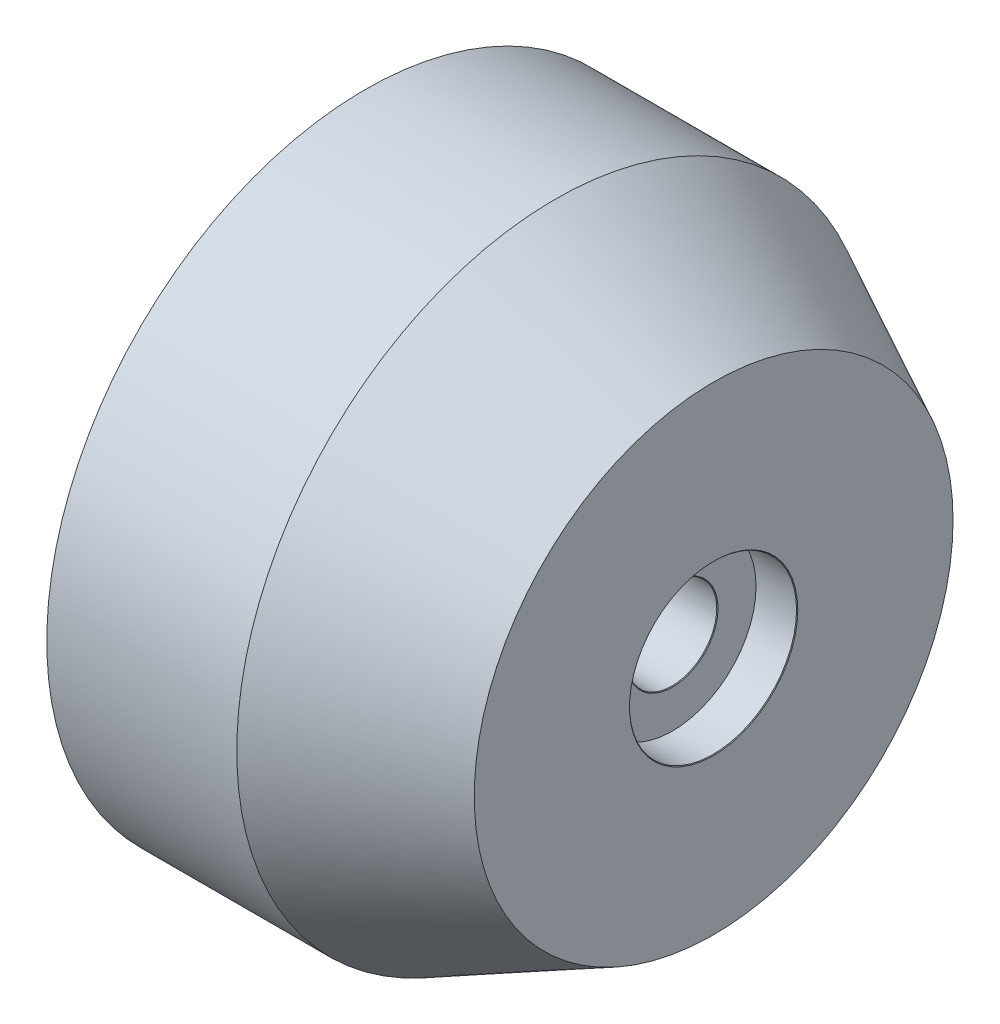
ISO-10303-21;
HEADER;
FILE_DESCRIPTION(('STEP AP214'),'2;1');
FILE_NAME('part.step','',(''),(''),'','','');
FILE_SCHEMA(('AUTOMOTIVE_DESIGN { 1 0 10303 214 1 1 1 1 }'));
ENDSEC;
DATA;
#1=APPLICATION_CONTEXT('core data for automotive mechanical design processes');
#2=APPLICATION_PROTOCOL_DEFINITION('international standard','automotive_design',2000,#1);
#3=PRODUCT_CONTEXT('',#1,'mechanical');
#4=PRODUCT('Part','Part','',(#3));
#5=PRODUCT_RELATED_PRODUCT_CATEGORY('part','',(#4));
#6=PRODUCT_DEFINITION_FORMATION('','',#4);
#7=PRODUCT_DEFINITION_CONTEXT('part definition',#1,'design');
#8=PRODUCT_DEFINITION('design','',#6,#7);
#9=PRODUCT_DEFINITION_SHAPE('','',#8);
#10=(LENGTH_UNIT() NAMED_UNIT(*) SI_UNIT(.MILLI.,.METRE.));
#11=(NAMED_UNIT(*) PLANE_ANGLE_UNIT() SI_UNIT($,.RADIAN.));
#12=(NAMED_UNIT(*) SI_UNIT($,.STERADIAN.) SOLID_ANGLE_UNIT());
#13=UNCERTAINTY_MEASURE_WITH_UNIT(LENGTH_MEASURE(1.E-05),#10,'distance_accuracy_value','');
#14=(GEOMETRIC_REPRESENTATION_CONTEXT(3) GLOBAL_UNCERTAINTY_ASSIGNED_CONTEXT((#13)) GLOBAL_UNIT_ASSIGNED_CONTEXT((#10,
#11,#12)) REPRESENTATION_CONTEXT('',''));
#15=CARTESIAN_POINT('',(0.,0.,0.));
#16=DIRECTION('',(0.,0.,1.));
#17=DIRECTION('',(1.,0.,0.));
#18=AXIS2_PLACEMENT_3D('',#15,#16,#17);
#19=CARTESIAN_POINT('',(-5.82137303331799,0.,0.));
#20=DIRECTION('',(-1.,0.,0.));
#21=DIRECTION('',(0.,0.,1.));
#22=AXIS2_PLACEMENT_3D('',#19,#20,#21);
#23=PLANE('',#22);
#24=CARTESIAN_POINT('',(-5.82137303331799,0.,0.));
#25=DIRECTION('',(-1.,0.,0.));
#26=DIRECTION('',(0.,0.,1.));
#27=AXIS2_PLACEMENT_3D('',#24,#25,#26);
#28=CIRCLE('',#27,1.8);
#29=CARTESIAN_POINT('',(-5.82137303331799,0.,1.8));
#30=VERTEX_POINT('',#29);
#31=EDGE_CURVE('E43',#30,#30,#28,.F.);
#32=ORIENTED_EDGE('',*,*,#31,.T.);
#33=EDGE_LOOP('',(#32));
#34=FACE_BOUND('',#33,.T.);
#35=CARTESIAN_POINT('',(-5.82137303331799,0.,0.));
#36=DIRECTION('',(-1.,0.,0.));
#37=DIRECTION('',(0.,0.,1.));
#38=AXIS2_PLACEMENT_3D('',#35,#36,#37);
#39=CIRCLE('',#38,5.08);
#40=CARTESIAN_POINT('',(-5.82137303331799,0.,5.08));
#41=VERTEX_POINT('',#40);
#42=EDGE_CURVE('E88',#41,#41,#39,.T.);
#43=ORIENTED_EDGE('',*,*,#42,.T.);
#44=EDGE_LOOP('',(#43));
#45=FACE_BOUND('',#44,.T.);
#46=ADVANCED_FACE('F39',(#34,#45),#23,.T.);
#47=CARTESIAN_POINT('',(-5.82137303331799,0.,0.));
#48=DIRECTION('',(-1.,0.,0.));
#49=DIRECTION('',(0.,0.,1.));
#50=AXIS2_PLACEMENT_3D('',#47,#48,#49);
#51=CIRCLE('',#50,6.35);
#52=CARTESIAN_POINT('',(-5.82137303331799,0.,6.35));
#53=VERTEX_POINT('',#52);
#54=EDGE_CURVE('E79',#53,#53,#51,.T.);
#55=ORIENTED_EDGE('',*,*,#54,.F.);
#56=EDGE_LOOP('',(#55));
#57=FACE_BOUND('',#56,.T.);
#58=CARTESIAN_POINT('',(-5.82137303331799,0.,0.));
#59=DIRECTION('',(1.,0.,0.));
#60=DIRECTION('',(0.,0.,-1.));
#61=AXIS2_PLACEMENT_3D('',#58,#59,#60);
#62=CIRCLE('',#61,12.7762);
#63=CARTESIAN_POINT('',(-5.82137303331799,0.,-12.7762));
#64=VERTEX_POINT('',#63);
#65=EDGE_CURVE('E67',#64,#64,#62,.T.);
#66=ORIENTED_EDGE('',*,*,#65,.F.);
#67=EDGE_LOOP('',(#66));
#68=FACE_BOUND('',#67,.T.);
#69=ADVANCED_FACE('F109',(#57,#68),#23,.T.);
#70=CARTESIAN_POINT('',(8.14862696668201,0.,0.));
#71=DIRECTION('',(1.,0.,0.));
#72=DIRECTION('',(0.,0.,-1.));
#73=AXIS2_PLACEMENT_3D('',#70,#71,#72);
#74=CONICAL_SURFACE('',#73,3.375,0.785398163397483);
#75=CARTESIAN_POINT('',(8.12362696668201,0.,0.));
#76=DIRECTION('',(1.,0.,0.));
#77=DIRECTION('',(0.,0.,-1.));
#78=AXIS2_PLACEMENT_3D('',#75,#76,#77);
#79=CIRCLE('',#78,3.35);
#80=CARTESIAN_POINT('',(8.12362696668201,0.,-3.35));
#81=VERTEX_POINT('',#80);
#82=EDGE_CURVE('E48',#81,#81,#79,.T.);
#83=ORIENTED_EDGE('',*,*,#82,.F.);
#84=EDGE_LOOP('',(#83));
#85=FACE_BOUND('',#84,.T.);
#86=CARTESIAN_POINT('',(8.14862696668201,0.,0.));
#87=DIRECTION('',(1.,0.,0.));
#88=DIRECTION('',(0.,0.,-1.));
#89=AXIS2_PLACEMENT_3D('',#86,#87,#88);
#90=CIRCLE('',#89,3.375);
#91=CARTESIAN_POINT('',(8.14862696668201,0.,-3.375));
#92=VERTEX_POINT('',#91);
#93=EDGE_CURVE('E10',#92,#92,#90,.T.);
#94=ORIENTED_EDGE('',*,*,#93,.T.);
#95=EDGE_LOOP('',(#94));
#96=FACE_BOUND('',#95,.T.);
#97=ADVANCED_FACE('F114',(#85,#96),#74,.F.);
#98=CARTESIAN_POINT('',(8.14862696668201,0.,0.));
#99=DIRECTION('',(1.,0.,0.));
#100=DIRECTION('',(0.,0.,-1.));
#101=AXIS2_PLACEMENT_3D('',#98,#99,#100);
#102=PLANE('',#101);
#103=ORIENTED_EDGE('',*,*,#93,.F.);
#104=EDGE_LOOP('',(#103));
#105=FACE_BOUND('',#104,.T.);
#106=CARTESIAN_POINT('',(8.14862696668201,0.,0.));
#107=DIRECTION('',(1.,0.,0.));
#108=DIRECTION('',(0.,0.,-1.));
#109=AXIS2_PLACEMENT_3D('',#106,#107,#108);
#110=CIRCLE('',#109,9.6012);
#111=CARTESIAN_POINT('',(8.14862696668201,0.,-9.6012));
#112=VERTEX_POINT('',#111);
#113=EDGE_CURVE('E71',#112,#112,#110,.T.);
#114=ORIENTED_EDGE('',*,*,#113,.T.);
#115=EDGE_LOOP('',(#114));
#116=FACE_BOUND('',#115,.T.);
#117=ADVANCED_FACE('F130',(#105,#116),#102,.T.);
#118=CARTESIAN_POINT('',(8.14862696668201,0.,0.));
#119=DIRECTION('',(-1.,0.,0.));
#120=DIRECTION('',(0.,0.,1.));
#121=AXIS2_PLACEMENT_3D('',#118,#119,#120);
#122=CONICAL_SURFACE('',#121,9.6012,0.463647609000804);
#123=CARTESIAN_POINT('',(1.79862696668198,0.,0.));
#124=DIRECTION('',(1.,0.,0.));
#125=DIRECTION('',(0.,0.,-1.));
#126=AXIS2_PLACEMENT_3D('',#123,#124,#125);
#127=CIRCLE('',#126,12.7762);
#128=CARTESIAN_POINT('',(1.79862696668198,0.,-12.7762));
#129=VERTEX_POINT('',#128);
#130=EDGE_CURVE('E75',#129,#129,#127,.F.);
#131=ORIENTED_EDGE('',*,*,#130,.F.);
#132=EDGE_LOOP('',(#131));
#133=FACE_BOUND('',#132,.T.);
#134=ORIENTED_EDGE('',*,*,#113,.F.);
#135=EDGE_LOOP('',(#134));
#136=FACE_BOUND('',#135,.T.);
#137=ADVANCED_FACE('F120',(#133,#136),#122,.T.);
#138=CARTESIAN_POINT('',(24.17211464598,0.,0.));
#139=DIRECTION('',(1.,0.,0.));
#140=DIRECTION('',(0.,0.,-1.));
#141=AXIS2_PLACEMENT_3D('',#138,#139,#140);
#142=CYLINDRICAL_SURFACE('',#141,12.7762);
#143=ORIENTED_EDGE('',*,*,#130,.T.);
#144=EDGE_LOOP('',(#143));
#145=FACE_BOUND('',#144,.T.);
#146=ORIENTED_EDGE('',*,*,#65,.T.);
#147=EDGE_LOOP('',(#146));
#148=FACE_BOUND('',#147,.T.);
#149=ADVANCED_FACE('F117',(#145,#148),#142,.T.);
#150=CARTESIAN_POINT('',(8.14862696668201,0.,0.));
#151=DIRECTION('',(1.,0.,0.));
#152=DIRECTION('',(0.,0.,-1.));
#153=AXIS2_PLACEMENT_3D('',#150,#151,#152);
#154=CYLINDRICAL_SURFACE('',#153,3.35);
#155=CARTESIAN_POINT('',(6.49862696668201,0.,0.));
#156=DIRECTION('',(1.,0.,0.));
#157=DIRECTION('',(0.,0.,-1.));
#158=AXIS2_PLACEMENT_3D('',#155,#156,#157);
#159=CIRCLE('',#158,3.35);
#160=CARTESIAN_POINT('',(6.49862696668201,0.,-3.35));
#161=VERTEX_POINT('',#160);
#162=EDGE_CURVE('E53',#161,#161,#159,.T.);
#163=ORIENTED_EDGE('',*,*,#162,.F.);
#164=EDGE_LOOP('',(#163));
#165=FACE_BOUND('',#164,.T.);
#166=ORIENTED_EDGE('',*,*,#82,.T.);
#167=EDGE_LOOP('',(#166));
#168=FACE_BOUND('',#167,.T.);
#169=ADVANCED_FACE('F119',(#165,#168),#154,.F.);
#170=CARTESIAN_POINT('',(6.49862696668201,1.825,0.));
#171=DIRECTION('',(-1.,0.,0.));
#172=DIRECTION('',(0.,0.,1.));
#173=AXIS2_PLACEMENT_3D('',#170,#171,#172);
#174=PLANE('',#173);
#175=CARTESIAN_POINT('',(6.49862696668201,0.,0.));
#176=DIRECTION('',(1.,0.,0.));
#177=DIRECTION('',(0.,0.,-1.));
#178=AXIS2_PLACEMENT_3D('',#175,#176,#177);
#179=CIRCLE('',#178,1.825);
#180=CARTESIAN_POINT('',(6.49862696668201,0.,-1.825));
#181=VERTEX_POINT('',#180);
#182=EDGE_CURVE('E59',#181,#181,#179,.T.);
#183=ORIENTED_EDGE('',*,*,#182,.F.);
#184=EDGE_LOOP('',(#183));
#185=FACE_BOUND('',#184,.T.);
#186=ORIENTED_EDGE('',*,*,#162,.T.);
#187=EDGE_LOOP('',(#186));
#188=FACE_BOUND('',#187,.T.);
#189=ADVANCED_FACE('F127',(#185,#188),#174,.F.);
#190=CARTESIAN_POINT('',(6.49862696668201,0.,0.));
#191=DIRECTION('',(1.,0.,0.));
#192=DIRECTION('',(0.,0.,-1.));
#193=AXIS2_PLACEMENT_3D('',#190,#191,#192);
#194=CONICAL_SURFACE('',#193,1.825,0.785398163397275);
#195=CARTESIAN_POINT('',(6.47362696668201,0.,0.));
#196=DIRECTION('',(1.,0.,0.));
#197=DIRECTION('',(0.,0.,-1.));
#198=AXIS2_PLACEMENT_3D('',#195,#196,#197);
#199=CIRCLE('',#198,1.80000000000001);
#200=CARTESIAN_POINT('',(6.47362696668201,0.,-1.80000000000001));
#201=VERTEX_POINT('',#200);
#202=EDGE_CURVE('E63',#201,#201,#199,.T.);
#203=ORIENTED_EDGE('',*,*,#202,.F.);
#204=EDGE_LOOP('',(#203));
#205=FACE_BOUND('',#204,.T.);
#206=ORIENTED_EDGE('',*,*,#182,.T.);
#207=EDGE_LOOP('',(#206));
#208=FACE_BOUND('',#207,.T.);
#209=ADVANCED_FACE('F151',(#205,#208),#194,.F.);
#210=CARTESIAN_POINT('',(-15.6638730333181,0.,0.));
#211=DIRECTION('',(-1.,0.,0.));
#212=DIRECTION('',(0.,0.,1.));
#213=AXIS2_PLACEMENT_3D('',#210,#211,#212);
#214=CYLINDRICAL_SURFACE('',#213,1.8);
#215=ORIENTED_EDGE('',*,*,#202,.T.);
#216=EDGE_LOOP('',(#215));
#217=FACE_BOUND('',#216,.T.);
#218=ORIENTED_EDGE('',*,*,#31,.F.);
#219=EDGE_LOOP('',(#218));
#220=FACE_BOUND('',#219,.T.);
#221=ADVANCED_FACE('F41',(#217,#220),#214,.F.);
#222=CARTESIAN_POINT('',(-4.55137303331799,0.,0.));
#223=DIRECTION('',(-1.,0.,0.));
#224=DIRECTION('',(0.,0.,1.));
#225=AXIS2_PLACEMENT_3D('',#222,#223,#224);
#226=CYLINDRICAL_SURFACE('',#225,6.35);
#227=CARTESIAN_POINT('',(-4.55137303331799,0.,0.));
#228=DIRECTION('',(-1.,0.,0.));
#229=DIRECTION('',(0.,0.,1.));
#230=AXIS2_PLACEMENT_3D('',#227,#228,#229);
#231=CIRCLE('',#230,6.35);
#232=CARTESIAN_POINT('',(-4.55137303331799,0.,6.35));
#233=VERTEX_POINT('',#232);
#234=EDGE_CURVE('E83',#233,#233,#231,.T.);
#235=ORIENTED_EDGE('',*,*,#234,.F.);
#236=EDGE_LOOP('',(#235));
#237=FACE_BOUND('',#236,.T.);
#238=ORIENTED_EDGE('',*,*,#54,.T.);
#239=EDGE_LOOP('',(#238));
#240=FACE_BOUND('',#239,.T.);
#241=ADVANCED_FACE('F102',(#237,#240),#226,.F.);
#242=CARTESIAN_POINT('',(-4.55137303331799,0.,0.));
#243=DIRECTION('',(-1.,0.,0.));
#244=DIRECTION('',(0.,0.,1.));
#245=AXIS2_PLACEMENT_3D('',#242,#243,#244);
#246=PLANE('',#245);
#247=CARTESIAN_POINT('',(-4.55137303331799,0.,0.));
#248=DIRECTION('',(-1.,0.,0.));
#249=DIRECTION('',(0.,0.,1.));
#250=AXIS2_PLACEMENT_3D('',#247,#248,#249);
#251=CIRCLE('',#250,5.08);
#252=CARTESIAN_POINT('',(-4.55137303331799,0.,5.08));
#253=VERTEX_POINT('',#252);
#254=EDGE_CURVE('E84',#253,#253,#251,.T.);
#255=ORIENTED_EDGE('',*,*,#254,.F.);
#256=EDGE_LOOP('',(#255));
#257=FACE_BOUND('',#256,.T.);
#258=ORIENTED_EDGE('',*,*,#234,.T.);
#259=EDGE_LOOP('',(#258));
#260=FACE_BOUND('',#259,.T.);
#261=ADVANCED_FACE('F99',(#257,#260),#246,.T.);
#262=CARTESIAN_POINT('',(-4.55137303331799,0.,0.));
#263=DIRECTION('',(-1.,0.,0.));
#264=DIRECTION('',(0.,0.,1.));
#265=AXIS2_PLACEMENT_3D('',#262,#263,#264);
#266=CYLINDRICAL_SURFACE('',#265,5.08);
#267=ORIENTED_EDGE('',*,*,#254,.T.);
#268=EDGE_LOOP('',(#267));
#269=FACE_BOUND('',#268,.T.);
#270=ORIENTED_EDGE('',*,*,#42,.F.);
#271=EDGE_LOOP('',(#270));
#272=FACE_BOUND('',#271,.T.);
#273=ADVANCED_FACE('F96',(#269,#272),#266,.T.);
#274=CLOSED_SHELL('',(#46,#69,#97,#117,#137,#149,#169,#189,#209,#221,#241,#261,#273));
#275=MANIFOLD_SOLID_BREP('B2',#274);
#276=ADVANCED_BREP_SHAPE_REPRESENTATION('',(#18,#275),#14);
#277=SHAPE_DEFINITION_REPRESENTATION(#9,#276);
ENDSEC;
END-ISO-10303-21;
